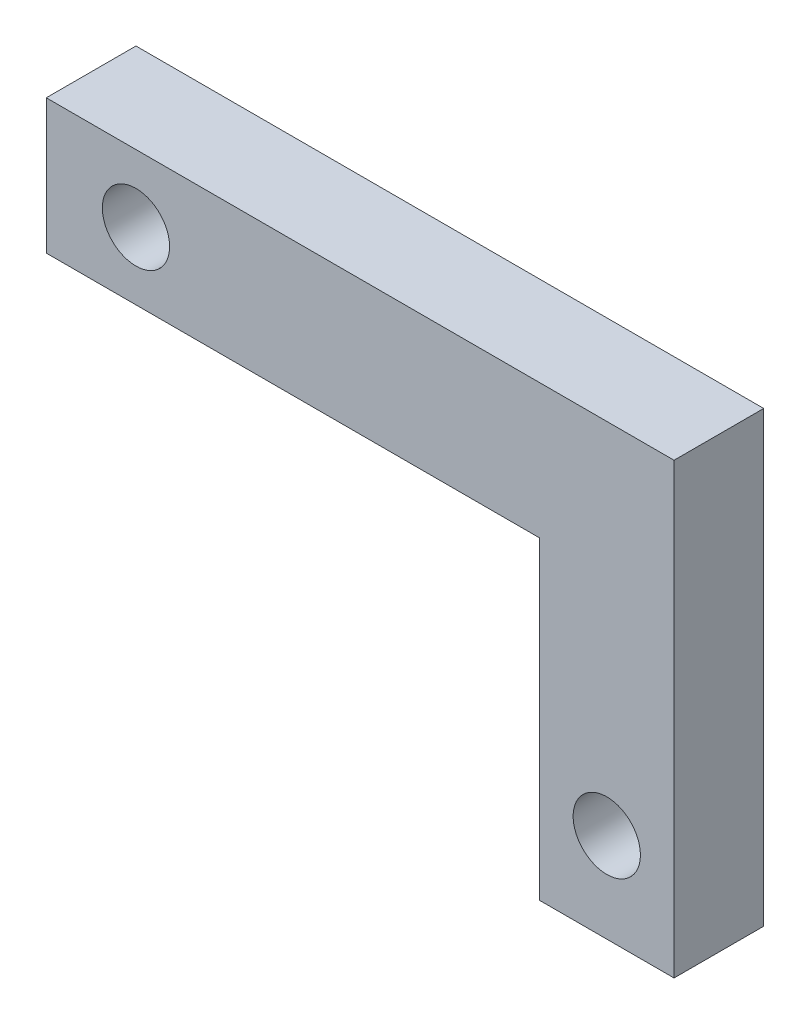
ISO-10303-21;
HEADER;
FILE_DESCRIPTION(('STEP AP214'),'2;1');
FILE_NAME('part.step','',(''),(''),'','','');
FILE_SCHEMA(('AUTOMOTIVE_DESIGN { 1 0 10303 214 1 1 1 1 }'));
ENDSEC;
DATA;
#1=APPLICATION_CONTEXT('core data for automotive mechanical design processes');
#2=APPLICATION_PROTOCOL_DEFINITION('international standard','automotive_design',2000,#1);
#3=PRODUCT_CONTEXT('',#1,'mechanical');
#4=PRODUCT('Part','Part','',(#3));
#5=PRODUCT_RELATED_PRODUCT_CATEGORY('part','',(#4));
#6=PRODUCT_DEFINITION_FORMATION('','',#4);
#7=PRODUCT_DEFINITION_CONTEXT('part definition',#1,'design');
#8=PRODUCT_DEFINITION('design','',#6,#7);
#9=PRODUCT_DEFINITION_SHAPE('','',#8);
#10=(LENGTH_UNIT() NAMED_UNIT(*) SI_UNIT(.MILLI.,.METRE.));
#11=(NAMED_UNIT(*) PLANE_ANGLE_UNIT() SI_UNIT($,.RADIAN.));
#12=(NAMED_UNIT(*) SI_UNIT($,.STERADIAN.) SOLID_ANGLE_UNIT());
#13=UNCERTAINTY_MEASURE_WITH_UNIT(LENGTH_MEASURE(1.E-05),#10,'distance_accuracy_value','');
#14=(GEOMETRIC_REPRESENTATION_CONTEXT(3) GLOBAL_UNCERTAINTY_ASSIGNED_CONTEXT((#13)) GLOBAL_UNIT_ASSIGNED_CONTEXT((#10,
#11,#12)) REPRESENTATION_CONTEXT('',''));
#15=CARTESIAN_POINT('',(0.,0.,0.));
#16=DIRECTION('',(0.,0.,1.));
#17=DIRECTION('',(1.,0.,0.));
#18=AXIS2_PLACEMENT_3D('',#15,#16,#17);
#19=CARTESIAN_POINT('',(0.,0.,25.4));
#20=DIRECTION('',(0.,1.,0.));
#21=DIRECTION('',(0.,0.,1.));
#22=AXIS2_PLACEMENT_3D('',#19,#20,#21);
#23=PLANE('',#22);
#24=DIRECTION('',(1.,0.,0.));
#25=VECTOR('',#24,1.);
#26=CARTESIAN_POINT('',(0.,0.,0.));
#27=LINE('',#26,#25);
#28=CARTESIAN_POINT('',(0.,0.,0.));
#29=VERTEX_POINT('',#28);
#30=CARTESIAN_POINT('',(139.7,0.,0.));
#31=VERTEX_POINT('',#30);
#32=EDGE_CURVE('E122',#29,#31,#27,.T.);
#33=ORIENTED_EDGE('',*,*,#32,.T.);
#34=DIRECTION('',(0.,0.,-1.));
#35=VECTOR('',#34,1.);
#36=CARTESIAN_POINT('',(139.7,0.,25.4));
#37=LINE('',#36,#35);
#38=CARTESIAN_POINT('',(139.7,0.,25.4));
#39=VERTEX_POINT('',#38);
#40=EDGE_CURVE('E11',#39,#31,#37,.T.);
#41=ORIENTED_EDGE('',*,*,#40,.F.);
#42=DIRECTION('',(1.,0.,0.));
#43=VECTOR('',#42,1.);
#44=CARTESIAN_POINT('',(0.,0.,25.4));
#45=LINE('',#44,#43);
#46=CARTESIAN_POINT('',(0.,0.,25.4));
#47=VERTEX_POINT('',#46);
#48=EDGE_CURVE('E137',#47,#39,#45,.T.);
#49=ORIENTED_EDGE('',*,*,#48,.F.);
#50=DIRECTION('',(0.,0.,-1.));
#51=VECTOR('',#50,1.);
#52=CARTESIAN_POINT('',(0.,0.,25.4));
#53=LINE('',#52,#51);
#54=EDGE_CURVE('E54',#47,#29,#53,.T.);
#55=ORIENTED_EDGE('',*,*,#54,.T.);
#56=EDGE_LOOP('',(#33,#41,#49,#55));
#57=FACE_BOUND('',#56,.T.);
#58=ADVANCED_FACE('F38',(#57),#23,.F.);
#59=CARTESIAN_POINT('',(139.7,0.,25.4));
#60=DIRECTION('',(1.,0.,0.));
#61=DIRECTION('',(0.,0.,-1.));
#62=AXIS2_PLACEMENT_3D('',#59,#60,#61);
#63=PLANE('',#62);
#64=DIRECTION('',(0.,-1.,0.));
#65=VECTOR('',#64,1.);
#66=CARTESIAN_POINT('',(139.7,0.,0.));
#67=LINE('',#66,#65);
#68=CARTESIAN_POINT('',(139.7,-88.9000000000001,0.));
#69=VERTEX_POINT('',#68);
#70=EDGE_CURVE('E124',#31,#69,#67,.T.);
#71=ORIENTED_EDGE('',*,*,#70,.T.);
#72=DIRECTION('',(0.,0.,-1.));
#73=VECTOR('',#72,1.);
#74=CARTESIAN_POINT('',(139.7,-88.9000000000001,25.4));
#75=LINE('',#74,#73);
#76=CARTESIAN_POINT('',(139.7,-88.9000000000001,25.4));
#77=VERTEX_POINT('',#76);
#78=EDGE_CURVE('E46',#77,#69,#75,.T.);
#79=ORIENTED_EDGE('',*,*,#78,.F.);
#80=DIRECTION('',(0.,-1.,0.));
#81=VECTOR('',#80,1.);
#82=CARTESIAN_POINT('',(139.7,0.,25.4));
#83=LINE('',#82,#81);
#84=EDGE_CURVE('E86',#39,#77,#83,.T.);
#85=ORIENTED_EDGE('',*,*,#84,.F.);
#86=ORIENTED_EDGE('',*,*,#40,.T.);
#87=EDGE_LOOP('',(#71,#79,#85,#86));
#88=FACE_BOUND('',#87,.T.);
#89=ADVANCED_FACE('F143',(#88),#63,.F.);
#90=CARTESIAN_POINT('',(0.,-88.9000000000001,25.4));
#91=DIRECTION('',(0.,-1.,0.));
#92=DIRECTION('',(1.,0.,0.));
#93=AXIS2_PLACEMENT_3D('',#90,#91,#92);
#94=PLANE('',#93);
#95=DIRECTION('',(-1.,0.,0.));
#96=VECTOR('',#95,1.);
#97=CARTESIAN_POINT('',(0.,-88.9000000000001,0.));
#98=LINE('',#97,#96);
#99=CARTESIAN_POINT('',(177.8,-88.9000000000001,0.));
#100=VERTEX_POINT('',#99);
#101=EDGE_CURVE('E128',#100,#69,#98,.T.);
#102=ORIENTED_EDGE('',*,*,#101,.F.);
#103=DIRECTION('',(0.,0.,-1.));
#104=VECTOR('',#103,1.);
#105=CARTESIAN_POINT('',(177.8,-88.9000000000001,25.4));
#106=LINE('',#105,#104);
#107=CARTESIAN_POINT('',(177.8,-88.9000000000001,25.4));
#108=VERTEX_POINT('',#107);
#109=EDGE_CURVE('E114',#108,#100,#106,.T.);
#110=ORIENTED_EDGE('',*,*,#109,.F.);
#111=DIRECTION('',(-1.,0.,0.));
#112=VECTOR('',#111,1.);
#113=CARTESIAN_POINT('',(0.,-88.9000000000001,25.4));
#114=LINE('',#113,#112);
#115=EDGE_CURVE('E104',#108,#77,#114,.T.);
#116=ORIENTED_EDGE('',*,*,#115,.T.);
#117=ORIENTED_EDGE('',*,*,#78,.T.);
#118=EDGE_LOOP('',(#102,#110,#116,#117));
#119=FACE_BOUND('',#118,.T.);
#120=ADVANCED_FACE('F142',(#119),#94,.T.);
#121=CARTESIAN_POINT('',(177.8,1.11022302462516E-13,25.4));
#122=DIRECTION('',(-1.,0.,0.));
#123=DIRECTION('',(0.,-1.,0.));
#124=AXIS2_PLACEMENT_3D('',#121,#122,#123);
#125=PLANE('',#124);
#126=DIRECTION('',(0.,1.,0.));
#127=VECTOR('',#126,1.);
#128=CARTESIAN_POINT('',(177.8,1.11022302462516E-13,0.));
#129=LINE('',#128,#127);
#130=CARTESIAN_POINT('',(177.8,38.1000000000001,0.));
#131=VERTEX_POINT('',#130);
#132=EDGE_CURVE('E111',#100,#131,#129,.T.);
#133=ORIENTED_EDGE('',*,*,#132,.T.);
#134=DIRECTION('',(0.,0.,-1.));
#135=VECTOR('',#134,1.);
#136=CARTESIAN_POINT('',(177.8,38.1000000000001,25.4));
#137=LINE('',#136,#135);
#138=CARTESIAN_POINT('',(177.8,38.1000000000001,25.4));
#139=VERTEX_POINT('',#138);
#140=EDGE_CURVE('E108',#139,#131,#137,.T.);
#141=ORIENTED_EDGE('',*,*,#140,.F.);
#142=DIRECTION('',(0.,1.,0.));
#143=VECTOR('',#142,1.);
#144=CARTESIAN_POINT('',(177.8,1.11022302462516E-13,25.4));
#145=LINE('',#144,#143);
#146=EDGE_CURVE('E97',#108,#139,#145,.T.);
#147=ORIENTED_EDGE('',*,*,#146,.F.);
#148=ORIENTED_EDGE('',*,*,#109,.T.);
#149=EDGE_LOOP('',(#133,#141,#147,#148));
#150=FACE_BOUND('',#149,.T.);
#151=ADVANCED_FACE('F109',(#150),#125,.F.);
#152=CARTESIAN_POINT('',(0.,38.1,25.4));
#153=DIRECTION('',(0.,1.,0.));
#154=DIRECTION('',(0.,0.,1.));
#155=AXIS2_PLACEMENT_3D('',#152,#153,#154);
#156=PLANE('',#155);
#157=DIRECTION('',(1.,0.,0.));
#158=VECTOR('',#157,1.);
#159=CARTESIAN_POINT('',(0.,38.1,0.));
#160=LINE('',#159,#158);
#161=CARTESIAN_POINT('',(0.,38.1,0.));
#162=VERTEX_POINT('',#161);
#163=EDGE_CURVE('E132',#162,#131,#160,.T.);
#164=ORIENTED_EDGE('',*,*,#163,.F.);
#165=DIRECTION('',(0.,0.,-1.));
#166=VECTOR('',#165,1.);
#167=CARTESIAN_POINT('',(0.,38.1,25.4));
#168=LINE('',#167,#166);
#169=CARTESIAN_POINT('',(0.,38.1,25.4));
#170=VERTEX_POINT('',#169);
#171=EDGE_CURVE('E74',#170,#162,#168,.T.);
#172=ORIENTED_EDGE('',*,*,#171,.F.);
#173=DIRECTION('',(1.,0.,0.));
#174=VECTOR('',#173,1.);
#175=CARTESIAN_POINT('',(0.,38.1,25.4));
#176=LINE('',#175,#174);
#177=EDGE_CURVE('E102',#170,#139,#176,.T.);
#178=ORIENTED_EDGE('',*,*,#177,.T.);
#179=ORIENTED_EDGE('',*,*,#140,.T.);
#180=EDGE_LOOP('',(#164,#172,#178,#179));
#181=FACE_BOUND('',#180,.T.);
#182=ADVANCED_FACE('F116',(#181),#156,.T.);
#183=CARTESIAN_POINT('',(0.,0.,25.4));
#184=DIRECTION('',(-1.,0.,0.));
#185=DIRECTION('',(0.,0.,1.));
#186=AXIS2_PLACEMENT_3D('',#183,#184,#185);
#187=PLANE('',#186);
#188=DIRECTION('',(0.,1.,0.));
#189=VECTOR('',#188,1.);
#190=CARTESIAN_POINT('',(0.,0.,0.));
#191=LINE('',#190,#189);
#192=EDGE_CURVE('E134',#29,#162,#191,.T.);
#193=ORIENTED_EDGE('',*,*,#192,.F.);
#194=ORIENTED_EDGE('',*,*,#54,.F.);
#195=DIRECTION('',(0.,1.,0.));
#196=VECTOR('',#195,1.);
#197=CARTESIAN_POINT('',(0.,0.,25.4));
#198=LINE('',#197,#196);
#199=EDGE_CURVE('E117',#47,#170,#198,.T.);
#200=ORIENTED_EDGE('',*,*,#199,.T.);
#201=ORIENTED_EDGE('',*,*,#171,.T.);
#202=EDGE_LOOP('',(#193,#194,#200,#201));
#203=FACE_BOUND('',#202,.T.);
#204=ADVANCED_FACE('F147',(#203),#187,.T.);
#205=CARTESIAN_POINT('',(0.,0.,25.4));
#206=DIRECTION('',(0.,0.,1.));
#207=DIRECTION('',(1.,0.,0.));
#208=AXIS2_PLACEMENT_3D('',#205,#206,#207);
#209=PLANE('',#208);
#210=CARTESIAN_POINT('',(158.75,-63.5,25.4));
#211=DIRECTION('',(0.,0.,1.));
#212=DIRECTION('',(1.,0.,0.));
#213=AXIS2_PLACEMENT_3D('',#210,#211,#212);
#214=CIRCLE('',#213,9.525);
#215=CARTESIAN_POINT('',(168.275,-63.5,25.4));
#216=VERTEX_POINT('',#215);
#217=EDGE_CURVE('E171',#216,#216,#214,.T.);
#218=ORIENTED_EDGE('',*,*,#217,.F.);
#219=EDGE_LOOP('',(#218));
#220=FACE_BOUND('',#219,.T.);
#221=CARTESIAN_POINT('',(25.4,19.05,25.4));
#222=DIRECTION('',(0.,0.,1.));
#223=DIRECTION('',(1.,0.,0.));
#224=AXIS2_PLACEMENT_3D('',#221,#222,#223);
#225=CIRCLE('',#224,9.52500000000001);
#226=CARTESIAN_POINT('',(34.925,19.05,25.4));
#227=VERTEX_POINT('',#226);
#228=EDGE_CURVE('E165',#227,#227,#225,.T.);
#229=ORIENTED_EDGE('',*,*,#228,.F.);
#230=EDGE_LOOP('',(#229));
#231=FACE_BOUND('',#230,.T.);
#232=ORIENTED_EDGE('',*,*,#48,.T.);
#233=ORIENTED_EDGE('',*,*,#84,.T.);
#234=ORIENTED_EDGE('',*,*,#115,.F.);
#235=ORIENTED_EDGE('',*,*,#146,.T.);
#236=ORIENTED_EDGE('',*,*,#177,.F.);
#237=ORIENTED_EDGE('',*,*,#199,.F.);
#238=EDGE_LOOP('',(#232,#233,#234,#235,#236,#237));
#239=FACE_BOUND('',#238,.T.);
#240=ADVANCED_FACE('F99',(#220,#231,#239),#209,.T.);
#241=CARTESIAN_POINT('',(0.,0.,0.));
#242=DIRECTION('',(0.,0.,1.));
#243=DIRECTION('',(1.,0.,0.));
#244=AXIS2_PLACEMENT_3D('',#241,#242,#243);
#245=PLANE('',#244);
#246=CARTESIAN_POINT('',(158.75,-63.5,0.));
#247=DIRECTION('',(0.,0.,1.));
#248=DIRECTION('',(1.,0.,0.));
#249=AXIS2_PLACEMENT_3D('',#246,#247,#248);
#250=CIRCLE('',#249,9.525);
#251=CARTESIAN_POINT('',(168.275,-63.5,0.));
#252=VERTEX_POINT('',#251);
#253=EDGE_CURVE('E168',#252,#252,#250,.T.);
#254=ORIENTED_EDGE('',*,*,#253,.T.);
#255=EDGE_LOOP('',(#254));
#256=FACE_BOUND('',#255,.T.);
#257=CARTESIAN_POINT('',(25.4,19.05,0.));
#258=DIRECTION('',(0.,0.,1.));
#259=DIRECTION('',(1.,0.,0.));
#260=AXIS2_PLACEMENT_3D('',#257,#258,#259);
#261=CIRCLE('',#260,9.52500000000001);
#262=CARTESIAN_POINT('',(34.925,19.05,0.));
#263=VERTEX_POINT('',#262);
#264=EDGE_CURVE('E125',#263,#263,#261,.T.);
#265=ORIENTED_EDGE('',*,*,#264,.T.);
#266=EDGE_LOOP('',(#265));
#267=FACE_BOUND('',#266,.T.);
#268=ORIENTED_EDGE('',*,*,#32,.F.);
#269=ORIENTED_EDGE('',*,*,#192,.T.);
#270=ORIENTED_EDGE('',*,*,#163,.T.);
#271=ORIENTED_EDGE('',*,*,#132,.F.);
#272=ORIENTED_EDGE('',*,*,#101,.T.);
#273=ORIENTED_EDGE('',*,*,#70,.F.);
#274=EDGE_LOOP('',(#268,#269,#270,#271,#272,#273));
#275=FACE_BOUND('',#274,.T.);
#276=ADVANCED_FACE('F146',(#256,#267,#275),#245,.F.);
#277=CARTESIAN_POINT('',(25.4,19.05,0.));
#278=DIRECTION('',(0.,0.,1.));
#279=DIRECTION('',(1.,0.,0.));
#280=AXIS2_PLACEMENT_3D('',#277,#278,#279);
#281=CYLINDRICAL_SURFACE('',#280,9.52500000000001);
#282=ORIENTED_EDGE('',*,*,#264,.F.);
#283=EDGE_LOOP('',(#282));
#284=FACE_BOUND('',#283,.T.);
#285=ORIENTED_EDGE('',*,*,#228,.T.);
#286=EDGE_LOOP('',(#285));
#287=FACE_BOUND('',#286,.T.);
#288=ADVANCED_FACE('F182',(#284,#287),#281,.F.);
#289=CARTESIAN_POINT('',(158.75,-63.5,0.));
#290=DIRECTION('',(0.,0.,1.));
#291=DIRECTION('',(1.,0.,0.));
#292=AXIS2_PLACEMENT_3D('',#289,#290,#291);
#293=CYLINDRICAL_SURFACE('',#292,9.525);
#294=ORIENTED_EDGE('',*,*,#253,.F.);
#295=EDGE_LOOP('',(#294));
#296=FACE_BOUND('',#295,.T.);
#297=ORIENTED_EDGE('',*,*,#217,.T.);
#298=EDGE_LOOP('',(#297));
#299=FACE_BOUND('',#298,.T.);
#300=ADVANCED_FACE('F179',(#296,#299),#293,.F.);
#301=CLOSED_SHELL('',(#58,#89,#120,#151,#182,#204,#240,#276,#288,#300));
#302=MANIFOLD_SOLID_BREP('B2',#301);
#303=ADVANCED_BREP_SHAPE_REPRESENTATION('',(#18,#302),#14);
#304=SHAPE_DEFINITION_REPRESENTATION(#9,#303);
ENDSEC;
END-ISO-10303-21;
